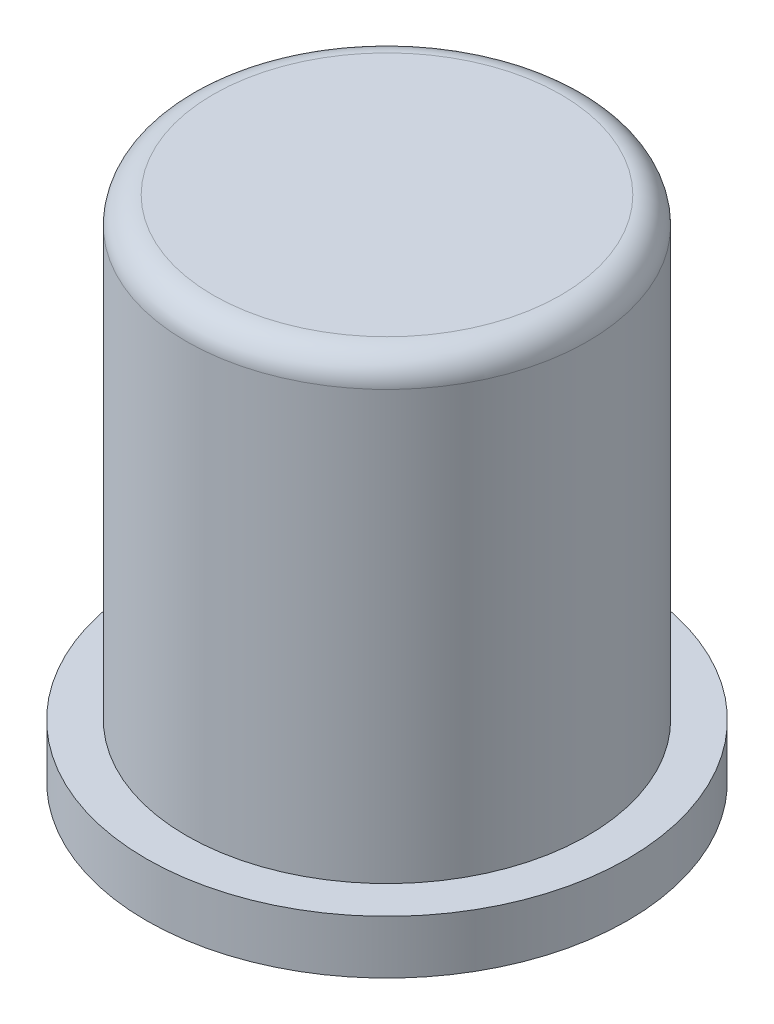
ISO-10303-21;
HEADER;
FILE_DESCRIPTION(('STEP AP214'),'2;1');
FILE_NAME('part.step','',(''),(''),'','','');
FILE_SCHEMA(('AUTOMOTIVE_DESIGN { 1 0 10303 214 1 1 1 1 }'));
ENDSEC;
DATA;
#1=APPLICATION_CONTEXT('core data for automotive mechanical design processes');
#2=APPLICATION_PROTOCOL_DEFINITION('international standard','automotive_design',2000,#1);
#3=PRODUCT_CONTEXT('',#1,'mechanical');
#4=PRODUCT('Part','Part','',(#3));
#5=PRODUCT_RELATED_PRODUCT_CATEGORY('part','',(#4));
#6=PRODUCT_DEFINITION_FORMATION('','',#4);
#7=PRODUCT_DEFINITION_CONTEXT('part definition',#1,'design');
#8=PRODUCT_DEFINITION('design','',#6,#7);
#9=PRODUCT_DEFINITION_SHAPE('','',#8);
#10=(LENGTH_UNIT() NAMED_UNIT(*) SI_UNIT(.MILLI.,.METRE.));
#11=(NAMED_UNIT(*) PLANE_ANGLE_UNIT() SI_UNIT($,.RADIAN.));
#12=(NAMED_UNIT(*) SI_UNIT($,.STERADIAN.) SOLID_ANGLE_UNIT());
#13=UNCERTAINTY_MEASURE_WITH_UNIT(LENGTH_MEASURE(1.E-05),#10,'distance_accuracy_value','');
#14=(GEOMETRIC_REPRESENTATION_CONTEXT(3) GLOBAL_UNCERTAINTY_ASSIGNED_CONTEXT((#13)) GLOBAL_UNIT_ASSIGNED_CONTEXT((#10,
#11,#12)) REPRESENTATION_CONTEXT('',''));
#15=CARTESIAN_POINT('',(0.,0.,0.));
#16=DIRECTION('',(0.,0.,1.));
#17=DIRECTION('',(1.,0.,0.));
#18=AXIS2_PLACEMENT_3D('',#15,#16,#17);
#19=CARTESIAN_POINT('',(0.,9.5,0.));
#20=DIRECTION('',(0.,-1.,0.));
#21=DIRECTION('',(0.,0.,-1.));
#22=AXIS2_PLACEMENT_3D('',#19,#20,#21);
#23=CYLINDRICAL_SURFACE('',#22,4.5);
#24=CARTESIAN_POINT('',(0.,0.,0.));
#25=DIRECTION('',(0.,1.,0.));
#26=DIRECTION('',(0.,0.,1.));
#27=AXIS2_PLACEMENT_3D('',#24,#25,#26);
#28=CIRCLE('',#27,4.5);
#29=CARTESIAN_POINT('',(0.,0.,4.5));
#30=VERTEX_POINT('',#29);
#31=EDGE_CURVE('E42',#30,#30,#28,.T.);
#32=ORIENTED_EDGE('',*,*,#31,.T.);
#33=EDGE_LOOP('',(#32));
#34=FACE_BOUND('',#33,.T.);
#35=CARTESIAN_POINT('',(0.,0.999999999999999,0.));
#36=DIRECTION('',(0.,1.,0.));
#37=DIRECTION('',(0.,0.,1.));
#38=AXIS2_PLACEMENT_3D('',#35,#36,#37);
#39=CIRCLE('',#38,4.5);
#40=CARTESIAN_POINT('',(0.,0.999999999999999,4.5));
#41=VERTEX_POINT('',#40);
#42=EDGE_CURVE('E46',#41,#41,#39,.T.);
#43=ORIENTED_EDGE('',*,*,#42,.F.);
#44=EDGE_LOOP('',(#43));
#45=FACE_BOUND('',#44,.T.);
#46=ADVANCED_FACE('F31',(#34,#45),#23,.T.);
#47=CARTESIAN_POINT('',(0.,0.,0.));
#48=DIRECTION('',(0.,1.,0.));
#49=DIRECTION('',(0.,0.,1.));
#50=AXIS2_PLACEMENT_3D('',#47,#48,#49);
#51=PLANE('',#50);
#52=ORIENTED_EDGE('',*,*,#31,.F.);
#53=EDGE_LOOP('',(#52));
#54=FACE_BOUND('',#53,.T.);
#55=ADVANCED_FACE('F60',(#54),#51,.F.);
#56=CARTESIAN_POINT('',(0.,0.999999999999999,0.));
#57=DIRECTION('',(0.,1.,0.));
#58=DIRECTION('',(0.,0.,1.));
#59=AXIS2_PLACEMENT_3D('',#56,#57,#58);
#60=PLANE('',#59);
#61=CARTESIAN_POINT('',(0.,0.999999999999999,0.));
#62=DIRECTION('',(0.,1.,0.));
#63=DIRECTION('',(0.,0.,1.));
#64=AXIS2_PLACEMENT_3D('',#61,#62,#63);
#65=CIRCLE('',#64,3.75);
#66=CARTESIAN_POINT('',(0.,0.999999999999999,3.75));
#67=VERTEX_POINT('',#66);
#68=EDGE_CURVE('E51',#67,#67,#65,.T.);
#69=ORIENTED_EDGE('',*,*,#68,.F.);
#70=EDGE_LOOP('',(#69));
#71=FACE_BOUND('',#70,.T.);
#72=ORIENTED_EDGE('',*,*,#42,.T.);
#73=EDGE_LOOP('',(#72));
#74=FACE_BOUND('',#73,.T.);
#75=ADVANCED_FACE('F57',(#71,#74),#60,.T.);
#76=CARTESIAN_POINT('',(0.,0.999999999999999,0.));
#77=DIRECTION('',(0.,1.,0.));
#78=DIRECTION('',(0.,0.,1.));
#79=AXIS2_PLACEMENT_3D('',#76,#77,#78);
#80=CYLINDRICAL_SURFACE('',#79,3.75);
#81=CARTESIAN_POINT('',(0.,9.,0.));
#82=DIRECTION('',(0.,1.,0.));
#83=DIRECTION('',(0.,0.,1.));
#84=AXIS2_PLACEMENT_3D('',#81,#82,#83);
#85=CIRCLE('',#84,3.75);
#86=CARTESIAN_POINT('',(0.,9.,3.75));
#87=VERTEX_POINT('',#86);
#88=EDGE_CURVE('E10',#87,#87,#85,.F.);
#89=ORIENTED_EDGE('',*,*,#88,.T.);
#90=EDGE_LOOP('',(#89));
#91=FACE_BOUND('',#90,.T.);
#92=ORIENTED_EDGE('',*,*,#68,.T.);
#93=EDGE_LOOP('',(#92));
#94=FACE_BOUND('',#93,.T.);
#95=ADVANCED_FACE('F55',(#91,#94),#80,.T.);
#96=CARTESIAN_POINT('',(0.,9.5,0.));
#97=DIRECTION('',(0.,1.,0.));
#98=DIRECTION('',(0.,0.,1.));
#99=AXIS2_PLACEMENT_3D('',#96,#97,#98);
#100=PLANE('',#99);
#101=CARTESIAN_POINT('',(0.,9.5,0.));
#102=DIRECTION('',(0.,1.,0.));
#103=DIRECTION('',(0.,0.,1.));
#104=AXIS2_PLACEMENT_3D('',#101,#102,#103);
#105=CIRCLE('',#104,3.25);
#106=CARTESIAN_POINT('',(0.,9.5,3.25));
#107=VERTEX_POINT('',#106);
#108=EDGE_CURVE('E38',#107,#107,#105,.T.);
#109=ORIENTED_EDGE('',*,*,#108,.T.);
#110=EDGE_LOOP('',(#109));
#111=FACE_BOUND('',#110,.T.);
#112=ADVANCED_FACE('F72',(#111),#100,.T.);
#113=CARTESIAN_POINT('',(0.,9.,0.));
#114=DIRECTION('',(0.,1.,0.));
#115=DIRECTION('',(0.,0.,1.));
#116=AXIS2_PLACEMENT_3D('',#113,#114,#115);
#117=TOROIDAL_SURFACE('',#116,3.25,0.5);
#118=ORIENTED_EDGE('',*,*,#88,.F.);
#119=EDGE_LOOP('',(#118));
#120=FACE_BOUND('',#119,.T.);
#121=ORIENTED_EDGE('',*,*,#108,.F.);
#122=EDGE_LOOP('',(#121));
#123=FACE_BOUND('',#122,.T.);
#124=ADVANCED_FACE('F33',(#120,#123),#117,.T.);
#125=CLOSED_SHELL('',(#46,#55,#75,#95,#112,#124));
#126=MANIFOLD_SOLID_BREP('B2',#125);
#127=ADVANCED_BREP_SHAPE_REPRESENTATION('',(#18,#126),#14);
#128=SHAPE_DEFINITION_REPRESENTATION(#9,#127);
ENDSEC;
END-ISO-10303-21;
